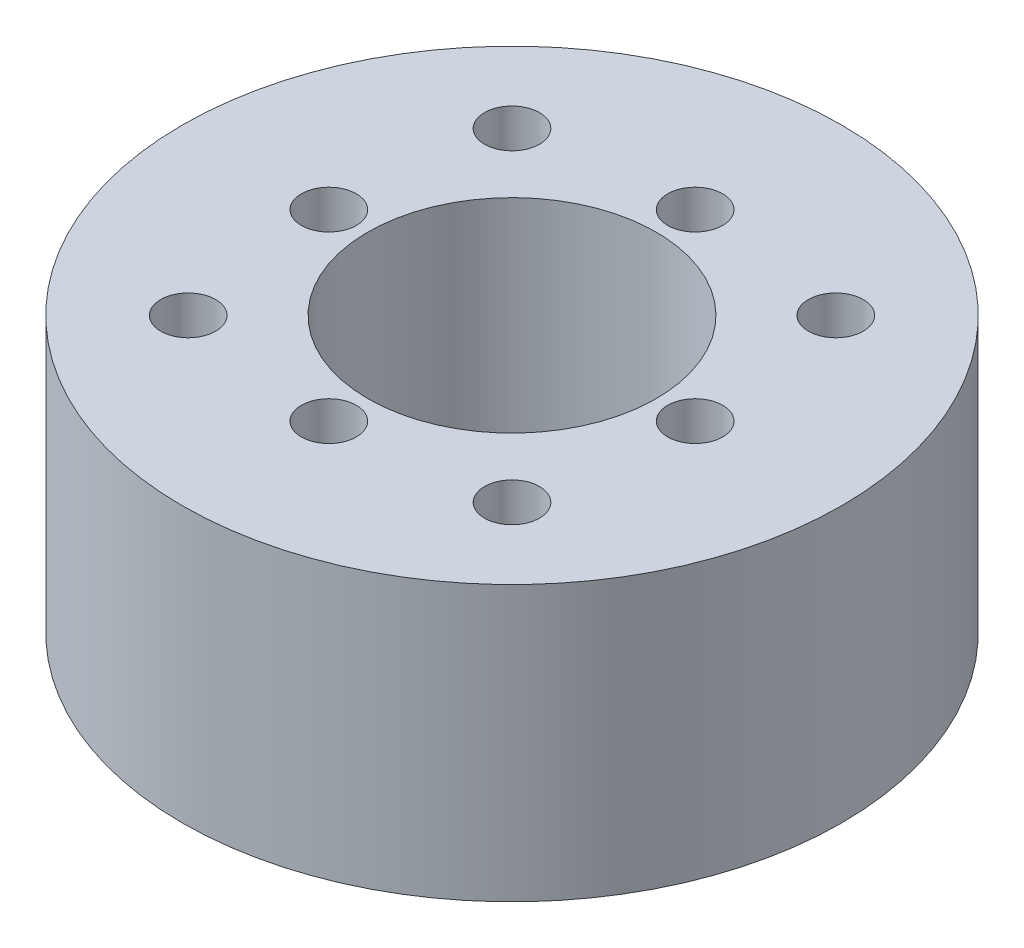
ISO-10303-21;
HEADER;
FILE_DESCRIPTION(('STEP AP214'),'2;1');
FILE_NAME('part.step','',(''),(''),'','','');
FILE_SCHEMA(('AUTOMOTIVE_DESIGN { 1 0 10303 214 1 1 1 1 }'));
ENDSEC;
DATA;
#1=APPLICATION_CONTEXT('core data for automotive mechanical design processes');
#2=APPLICATION_PROTOCOL_DEFINITION('international standard','automotive_design',2000,#1);
#3=PRODUCT_CONTEXT('',#1,'mechanical');
#4=PRODUCT('Part','Part','',(#3));
#5=PRODUCT_RELATED_PRODUCT_CATEGORY('part','',(#4));
#6=PRODUCT_DEFINITION_FORMATION('','',#4);
#7=PRODUCT_DEFINITION_CONTEXT('part definition',#1,'design');
#8=PRODUCT_DEFINITION('design','',#6,#7);
#9=PRODUCT_DEFINITION_SHAPE('','',#8);
#10=(LENGTH_UNIT() NAMED_UNIT(*) SI_UNIT(.MILLI.,.METRE.));
#11=(NAMED_UNIT(*) PLANE_ANGLE_UNIT() SI_UNIT($,.RADIAN.));
#12=(NAMED_UNIT(*) SI_UNIT($,.STERADIAN.) SOLID_ANGLE_UNIT());
#13=UNCERTAINTY_MEASURE_WITH_UNIT(LENGTH_MEASURE(1.E-05),#10,'distance_accuracy_value','');
#14=(GEOMETRIC_REPRESENTATION_CONTEXT(3) GLOBAL_UNCERTAINTY_ASSIGNED_CONTEXT((#13)) GLOBAL_UNIT_ASSIGNED_CONTEXT((#10,
#11,#12)) REPRESENTATION_CONTEXT('',''));
#15=CARTESIAN_POINT('',(0.,0.,0.));
#16=DIRECTION('',(0.,0.,1.));
#17=DIRECTION('',(1.,0.,0.));
#18=AXIS2_PLACEMENT_3D('',#15,#16,#17);
#19=CARTESIAN_POINT('',(0.,30.,0.));
#20=DIRECTION('',(0.,-1.,0.));
#21=DIRECTION('',(0.,0.,-1.));
#22=AXIS2_PLACEMENT_3D('',#19,#20,#21);
#23=CYLINDRICAL_SURFACE('',#22,36.);
#24=CARTESIAN_POINT('',(0.,30.,0.));
#25=DIRECTION('',(0.,1.,0.));
#26=DIRECTION('',(0.,0.,1.));
#27=AXIS2_PLACEMENT_3D('',#24,#25,#26);
#28=CIRCLE('',#27,36.);
#29=CARTESIAN_POINT('',(0.,30.,36.));
#30=VERTEX_POINT('',#29);
#31=EDGE_CURVE('E10',#30,#30,#28,.T.);
#32=ORIENTED_EDGE('',*,*,#31,.F.);
#33=EDGE_LOOP('',(#32));
#34=FACE_BOUND('',#33,.T.);
#35=CARTESIAN_POINT('',(0.,0.,0.));
#36=DIRECTION('',(0.,1.,0.));
#37=DIRECTION('',(0.,0.,1.));
#38=AXIS2_PLACEMENT_3D('',#35,#36,#37);
#39=CIRCLE('',#38,36.);
#40=CARTESIAN_POINT('',(0.,0.,36.));
#41=VERTEX_POINT('',#40);
#42=EDGE_CURVE('E44',#41,#41,#39,.T.);
#43=ORIENTED_EDGE('',*,*,#42,.T.);
#44=EDGE_LOOP('',(#43));
#45=FACE_BOUND('',#44,.T.);
#46=ADVANCED_FACE('F41',(#34,#45),#23,.T.);
#47=CARTESIAN_POINT('',(0.,30.,0.));
#48=DIRECTION('',(0.,1.,0.));
#49=DIRECTION('',(0.,0.,1.));
#50=AXIS2_PLACEMENT_3D('',#47,#48,#49);
#51=PLANE('',#50);
#52=CARTESIAN_POINT('',(0.,30.,0.));
#53=DIRECTION('',(0.,1.,0.));
#54=DIRECTION('',(0.,0.,1.));
#55=AXIS2_PLACEMENT_3D('',#52,#53,#54);
#56=CIRCLE('',#55,15.75);
#57=CARTESIAN_POINT('',(0.,30.,15.75));
#58=VERTEX_POINT('',#57);
#59=EDGE_CURVE('E119',#58,#58,#56,.T.);
#60=ORIENTED_EDGE('',*,*,#59,.F.);
#61=EDGE_LOOP('',(#60));
#62=FACE_BOUND('',#61,.T.);
#63=CARTESIAN_POINT('',(-17.6776695296637,30.,-17.6776695296632));
#64=DIRECTION('',(0.,1.,0.));
#65=DIRECTION('',(0.,0.,1.));
#66=AXIS2_PLACEMENT_3D('',#63,#64,#65);
#67=CIRCLE('',#66,3.00000000000059);
#68=CARTESIAN_POINT('',(-17.6776695296637,30.,-14.6776695296626));
#69=VERTEX_POINT('',#68);
#70=EDGE_CURVE('E99',#69,#69,#67,.T.);
#71=ORIENTED_EDGE('',*,*,#70,.F.);
#72=EDGE_LOOP('',(#71));
#73=FACE_BOUND('',#72,.T.);
#74=CARTESIAN_POINT('',(-17.6776695296632,30.,17.6776695296642));
#75=DIRECTION('',(0.,1.,0.));
#76=DIRECTION('',(0.,0.,1.));
#77=AXIS2_PLACEMENT_3D('',#74,#75,#76);
#78=CIRCLE('',#77,3.00000000000041);
#79=CARTESIAN_POINT('',(-17.6776695296632,30.,20.6776695296646));
#80=VERTEX_POINT('',#79);
#81=EDGE_CURVE('E108',#80,#80,#78,.T.);
#82=ORIENTED_EDGE('',*,*,#81,.F.);
#83=EDGE_LOOP('',(#82));
#84=FACE_BOUND('',#83,.T.);
#85=CARTESIAN_POINT('',(17.6776695296642,30.,17.6776695296637));
#86=DIRECTION('',(0.,1.,0.));
#87=DIRECTION('',(0.,0.,1.));
#88=AXIS2_PLACEMENT_3D('',#85,#86,#87);
#89=CIRCLE('',#88,2.9999999999999);
#90=CARTESIAN_POINT('',(17.6776695296642,30.,20.6776695296636));
#91=VERTEX_POINT('',#90);
#92=EDGE_CURVE('E91',#91,#91,#89,.T.);
#93=ORIENTED_EDGE('',*,*,#92,.F.);
#94=EDGE_LOOP('',(#93));
#95=FACE_BOUND('',#94,.T.);
#96=CARTESIAN_POINT('',(17.6776695296637,30.,-17.6776695296637));
#97=DIRECTION('',(0.,1.,0.));
#98=DIRECTION('',(0.,0.,1.));
#99=AXIS2_PLACEMENT_3D('',#96,#97,#98);
#100=CIRCLE('',#99,3.);
#101=CARTESIAN_POINT('',(17.6776695296637,30.,-14.6776695296637));
#102=VERTEX_POINT('',#101);
#103=EDGE_CURVE('E87',#102,#102,#100,.T.);
#104=ORIENTED_EDGE('',*,*,#103,.F.);
#105=EDGE_LOOP('',(#104));
#106=FACE_BOUND('',#105,.T.);
#107=CARTESIAN_POINT('',(20.,30.,0.));
#108=DIRECTION('',(0.,1.,0.));
#109=DIRECTION('',(0.,0.,1.));
#110=AXIS2_PLACEMENT_3D('',#107,#108,#109);
#111=CIRCLE('',#110,3.);
#112=CARTESIAN_POINT('',(20.,30.,3.));
#113=VERTEX_POINT('',#112);
#114=EDGE_CURVE('E80',#113,#113,#111,.T.);
#115=ORIENTED_EDGE('',*,*,#114,.F.);
#116=EDGE_LOOP('',(#115));
#117=FACE_BOUND('',#116,.T.);
#118=CARTESIAN_POINT('',(0.,30.,20.));
#119=DIRECTION('',(0.,1.,0.));
#120=DIRECTION('',(0.,0.,1.));
#121=AXIS2_PLACEMENT_3D('',#118,#119,#120);
#122=CIRCLE('',#121,3.);
#123=CARTESIAN_POINT('',(0.,30.,23.));
#124=VERTEX_POINT('',#123);
#125=EDGE_CURVE('E76',#124,#124,#122,.T.);
#126=ORIENTED_EDGE('',*,*,#125,.F.);
#127=EDGE_LOOP('',(#126));
#128=FACE_BOUND('',#127,.T.);
#129=CARTESIAN_POINT('',(-20.,30.,-1.39659253553725E-13));
#130=DIRECTION('',(0.,1.,0.));
#131=DIRECTION('',(0.,0.,1.));
#132=AXIS2_PLACEMENT_3D('',#129,#130,#131);
#133=CIRCLE('',#132,3.);
#134=CARTESIAN_POINT('',(-20.,30.,2.99999999999986));
#135=VERTEX_POINT('',#134);
#136=EDGE_CURVE('E68',#135,#135,#133,.T.);
#137=ORIENTED_EDGE('',*,*,#136,.F.);
#138=EDGE_LOOP('',(#137));
#139=FACE_BOUND('',#138,.T.);
#140=CARTESIAN_POINT('',(2.09488880330588E-13,30.,-20.));
#141=DIRECTION('',(0.,1.,0.));
#142=DIRECTION('',(0.,0.,1.));
#143=AXIS2_PLACEMENT_3D('',#140,#141,#142);
#144=CIRCLE('',#143,3.);
#145=CARTESIAN_POINT('',(2.09488880330588E-13,30.,-17.));
#146=VERTEX_POINT('',#145);
#147=EDGE_CURVE('E59',#146,#146,#144,.T.);
#148=ORIENTED_EDGE('',*,*,#147,.F.);
#149=EDGE_LOOP('',(#148));
#150=FACE_BOUND('',#149,.T.);
#151=ORIENTED_EDGE('',*,*,#31,.T.);
#152=EDGE_LOOP('',(#151));
#153=FACE_BOUND('',#152,.T.);
#154=ADVANCED_FACE('F137',(#62,#73,#84,#95,#106,#117,#128,#139,#150,#153),#51,.T.);
#155=CARTESIAN_POINT('',(0.,0.,0.));
#156=DIRECTION('',(0.,1.,0.));
#157=DIRECTION('',(0.,0.,1.));
#158=AXIS2_PLACEMENT_3D('',#155,#156,#157);
#159=PLANE('',#158);
#160=CARTESIAN_POINT('',(0.,0.,0.));
#161=DIRECTION('',(0.,1.,0.));
#162=DIRECTION('',(0.,0.,1.));
#163=AXIS2_PLACEMENT_3D('',#160,#161,#162);
#164=CIRCLE('',#163,15.75);
#165=CARTESIAN_POINT('',(0.,0.,15.75));
#166=VERTEX_POINT('',#165);
#167=EDGE_CURVE('E100',#166,#166,#164,.T.);
#168=ORIENTED_EDGE('',*,*,#167,.T.);
#169=EDGE_LOOP('',(#168));
#170=FACE_BOUND('',#169,.T.);
#171=CARTESIAN_POINT('',(-17.6776695296637,0.,-17.6776695296632));
#172=DIRECTION('',(0.,1.,0.));
#173=DIRECTION('',(0.,0.,1.));
#174=AXIS2_PLACEMENT_3D('',#171,#172,#173);
#175=CIRCLE('',#174,3.00000000000059);
#176=CARTESIAN_POINT('',(-17.6776695296637,0.,-14.6776695296626));
#177=VERTEX_POINT('',#176);
#178=EDGE_CURVE('E95',#177,#177,#175,.T.);
#179=ORIENTED_EDGE('',*,*,#178,.T.);
#180=EDGE_LOOP('',(#179));
#181=FACE_BOUND('',#180,.T.);
#182=CARTESIAN_POINT('',(-17.6776695296632,0.,17.6776695296642));
#183=DIRECTION('',(0.,1.,0.));
#184=DIRECTION('',(0.,0.,1.));
#185=AXIS2_PLACEMENT_3D('',#182,#183,#184);
#186=CIRCLE('',#185,3.00000000000041);
#187=CARTESIAN_POINT('',(-17.6776695296632,0.,20.6776695296646));
#188=VERTEX_POINT('',#187);
#189=EDGE_CURVE('E104',#188,#188,#186,.T.);
#190=ORIENTED_EDGE('',*,*,#189,.T.);
#191=EDGE_LOOP('',(#190));
#192=FACE_BOUND('',#191,.T.);
#193=CARTESIAN_POINT('',(17.6776695296642,0.,17.6776695296637));
#194=DIRECTION('',(0.,1.,0.));
#195=DIRECTION('',(0.,0.,1.));
#196=AXIS2_PLACEMENT_3D('',#193,#194,#195);
#197=CIRCLE('',#196,2.9999999999999);
#198=CARTESIAN_POINT('',(17.6776695296642,0.,20.6776695296636));
#199=VERTEX_POINT('',#198);
#200=EDGE_CURVE('E112',#199,#199,#197,.T.);
#201=ORIENTED_EDGE('',*,*,#200,.T.);
#202=EDGE_LOOP('',(#201));
#203=FACE_BOUND('',#202,.T.);
#204=CARTESIAN_POINT('',(17.6776695296637,0.,-17.6776695296637));
#205=DIRECTION('',(0.,1.,0.));
#206=DIRECTION('',(0.,0.,1.));
#207=AXIS2_PLACEMENT_3D('',#204,#205,#206);
#208=CIRCLE('',#207,3.);
#209=CARTESIAN_POINT('',(17.6776695296637,0.,-14.6776695296637));
#210=VERTEX_POINT('',#209);
#211=EDGE_CURVE('E60',#210,#210,#208,.T.);
#212=ORIENTED_EDGE('',*,*,#211,.T.);
#213=EDGE_LOOP('',(#212));
#214=FACE_BOUND('',#213,.T.);
#215=CARTESIAN_POINT('',(20.,0.,0.));
#216=DIRECTION('',(0.,1.,0.));
#217=DIRECTION('',(0.,0.,1.));
#218=AXIS2_PLACEMENT_3D('',#215,#216,#217);
#219=CIRCLE('',#218,3.);
#220=CARTESIAN_POINT('',(20.,0.,3.));
#221=VERTEX_POINT('',#220);
#222=EDGE_CURVE('E53',#221,#221,#219,.T.);
#223=ORIENTED_EDGE('',*,*,#222,.T.);
#224=EDGE_LOOP('',(#223));
#225=FACE_BOUND('',#224,.T.);
#226=CARTESIAN_POINT('',(0.,0.,20.));
#227=DIRECTION('',(0.,1.,0.));
#228=DIRECTION('',(0.,0.,1.));
#229=AXIS2_PLACEMENT_3D('',#226,#227,#228);
#230=CIRCLE('',#229,3.);
#231=CARTESIAN_POINT('',(0.,0.,23.));
#232=VERTEX_POINT('',#231);
#233=EDGE_CURVE('E72',#232,#232,#230,.T.);
#234=ORIENTED_EDGE('',*,*,#233,.T.);
#235=EDGE_LOOP('',(#234));
#236=FACE_BOUND('',#235,.T.);
#237=CARTESIAN_POINT('',(-20.,0.,-1.39659253553725E-13));
#238=DIRECTION('',(0.,1.,0.));
#239=DIRECTION('',(0.,0.,1.));
#240=AXIS2_PLACEMENT_3D('',#237,#238,#239);
#241=CIRCLE('',#240,3.);
#242=CARTESIAN_POINT('',(-20.,0.,2.99999999999986));
#243=VERTEX_POINT('',#242);
#244=EDGE_CURVE('E64',#243,#243,#241,.T.);
#245=ORIENTED_EDGE('',*,*,#244,.T.);
#246=EDGE_LOOP('',(#245));
#247=FACE_BOUND('',#246,.T.);
#248=CARTESIAN_POINT('',(2.09488880330588E-13,0.,-20.));
#249=DIRECTION('',(0.,1.,0.));
#250=DIRECTION('',(0.,0.,1.));
#251=AXIS2_PLACEMENT_3D('',#248,#249,#250);
#252=CIRCLE('',#251,3.);
#253=CARTESIAN_POINT('',(2.09488880330588E-13,0.,-17.));
#254=VERTEX_POINT('',#253);
#255=EDGE_CURVE('E55',#254,#254,#252,.T.);
#256=ORIENTED_EDGE('',*,*,#255,.T.);
#257=EDGE_LOOP('',(#256));
#258=FACE_BOUND('',#257,.T.);
#259=ORIENTED_EDGE('',*,*,#42,.F.);
#260=EDGE_LOOP('',(#259));
#261=FACE_BOUND('',#260,.T.);
#262=ADVANCED_FACE('F127',(#170,#181,#192,#203,#214,#225,#236,#247,#258,#261),#159,.F.);
#263=CARTESIAN_POINT('',(2.09488880330588E-13,0.,-20.));
#264=DIRECTION('',(0.,1.,0.));
#265=DIRECTION('',(0.,0.,1.));
#266=AXIS2_PLACEMENT_3D('',#263,#264,#265);
#267=CYLINDRICAL_SURFACE('',#266,3.);
#268=ORIENTED_EDGE('',*,*,#255,.F.);
#269=EDGE_LOOP('',(#268));
#270=FACE_BOUND('',#269,.T.);
#271=ORIENTED_EDGE('',*,*,#147,.T.);
#272=EDGE_LOOP('',(#271));
#273=FACE_BOUND('',#272,.T.);
#274=ADVANCED_FACE('F157',(#270,#273),#267,.F.);
#275=CARTESIAN_POINT('',(-20.,0.,-1.39659253553725E-13));
#276=DIRECTION('',(0.,1.,0.));
#277=DIRECTION('',(0.,0.,1.));
#278=AXIS2_PLACEMENT_3D('',#275,#276,#277);
#279=CYLINDRICAL_SURFACE('',#278,3.);
#280=ORIENTED_EDGE('',*,*,#244,.F.);
#281=EDGE_LOOP('',(#280));
#282=FACE_BOUND('',#281,.T.);
#283=ORIENTED_EDGE('',*,*,#136,.T.);
#284=EDGE_LOOP('',(#283));
#285=FACE_BOUND('',#284,.T.);
#286=ADVANCED_FACE('F159',(#282,#285),#279,.F.);
#287=CARTESIAN_POINT('',(0.,0.,20.));
#288=DIRECTION('',(0.,1.,0.));
#289=DIRECTION('',(0.,0.,1.));
#290=AXIS2_PLACEMENT_3D('',#287,#288,#289);
#291=CYLINDRICAL_SURFACE('',#290,3.);
#292=ORIENTED_EDGE('',*,*,#233,.F.);
#293=EDGE_LOOP('',(#292));
#294=FACE_BOUND('',#293,.T.);
#295=ORIENTED_EDGE('',*,*,#125,.T.);
#296=EDGE_LOOP('',(#295));
#297=FACE_BOUND('',#296,.T.);
#298=ADVANCED_FACE('F166',(#294,#297),#291,.F.);
#299=CARTESIAN_POINT('',(20.,0.,0.));
#300=DIRECTION('',(0.,1.,0.));
#301=DIRECTION('',(0.,0.,1.));
#302=AXIS2_PLACEMENT_3D('',#299,#300,#301);
#303=CYLINDRICAL_SURFACE('',#302,3.);
#304=ORIENTED_EDGE('',*,*,#222,.F.);
#305=EDGE_LOOP('',(#304));
#306=FACE_BOUND('',#305,.T.);
#307=ORIENTED_EDGE('',*,*,#114,.T.);
#308=EDGE_LOOP('',(#307));
#309=FACE_BOUND('',#308,.T.);
#310=ADVANCED_FACE('F226',(#306,#309),#303,.F.);
#311=CARTESIAN_POINT('',(17.6776695296637,0.,-17.6776695296637));
#312=DIRECTION('',(0.,1.,0.));
#313=DIRECTION('',(0.,0.,1.));
#314=AXIS2_PLACEMENT_3D('',#311,#312,#313);
#315=CYLINDRICAL_SURFACE('',#314,3.);
#316=ORIENTED_EDGE('',*,*,#211,.F.);
#317=EDGE_LOOP('',(#316));
#318=FACE_BOUND('',#317,.T.);
#319=ORIENTED_EDGE('',*,*,#103,.T.);
#320=EDGE_LOOP('',(#319));
#321=FACE_BOUND('',#320,.T.);
#322=ADVANCED_FACE('F218',(#318,#321),#315,.F.);
#323=CARTESIAN_POINT('',(17.6776695296642,0.,17.6776695296637));
#324=DIRECTION('',(0.,1.,0.));
#325=DIRECTION('',(0.,0.,1.));
#326=AXIS2_PLACEMENT_3D('',#323,#324,#325);
#327=CYLINDRICAL_SURFACE('',#326,2.9999999999999);
#328=ORIENTED_EDGE('',*,*,#200,.F.);
#329=EDGE_LOOP('',(#328));
#330=FACE_BOUND('',#329,.T.);
#331=ORIENTED_EDGE('',*,*,#92,.T.);
#332=EDGE_LOOP('',(#331));
#333=FACE_BOUND('',#332,.T.);
#334=ADVANCED_FACE('F210',(#330,#333),#327,.F.);
#335=CARTESIAN_POINT('',(-17.6776695296632,0.,17.6776695296642));
#336=DIRECTION('',(0.,1.,0.));
#337=DIRECTION('',(0.,0.,1.));
#338=AXIS2_PLACEMENT_3D('',#335,#336,#337);
#339=CYLINDRICAL_SURFACE('',#338,3.00000000000041);
#340=ORIENTED_EDGE('',*,*,#189,.F.);
#341=EDGE_LOOP('',(#340));
#342=FACE_BOUND('',#341,.T.);
#343=ORIENTED_EDGE('',*,*,#81,.T.);
#344=EDGE_LOOP('',(#343));
#345=FACE_BOUND('',#344,.T.);
#346=ADVANCED_FACE('F203',(#342,#345),#339,.F.);
#347=CARTESIAN_POINT('',(-17.6776695296637,0.,-17.6776695296632));
#348=DIRECTION('',(0.,1.,0.));
#349=DIRECTION('',(0.,0.,1.));
#350=AXIS2_PLACEMENT_3D('',#347,#348,#349);
#351=CYLINDRICAL_SURFACE('',#350,3.00000000000059);
#352=ORIENTED_EDGE('',*,*,#178,.F.);
#353=EDGE_LOOP('',(#352));
#354=FACE_BOUND('',#353,.T.);
#355=ORIENTED_EDGE('',*,*,#70,.T.);
#356=EDGE_LOOP('',(#355));
#357=FACE_BOUND('',#356,.T.);
#358=ADVANCED_FACE('F133',(#354,#357),#351,.F.);
#359=CARTESIAN_POINT('',(0.,0.,0.));
#360=DIRECTION('',(0.,1.,0.));
#361=DIRECTION('',(0.,0.,1.));
#362=AXIS2_PLACEMENT_3D('',#359,#360,#361);
#363=CYLINDRICAL_SURFACE('',#362,15.75);
#364=ORIENTED_EDGE('',*,*,#167,.F.);
#365=EDGE_LOOP('',(#364));
#366=FACE_BOUND('',#365,.T.);
#367=ORIENTED_EDGE('',*,*,#59,.T.);
#368=EDGE_LOOP('',(#367));
#369=FACE_BOUND('',#368,.T.);
#370=ADVANCED_FACE('F130',(#366,#369),#363,.F.);
#371=CLOSED_SHELL('',(#46,#154,#262,#274,#286,#298,#310,#322,#334,#346,#358,#370));
#372=MANIFOLD_SOLID_BREP('B2',#371);
#373=ADVANCED_BREP_SHAPE_REPRESENTATION('',(#18,#372),#14);
#374=SHAPE_DEFINITION_REPRESENTATION(#9,#373);
ENDSEC;
END-ISO-10303-21;
